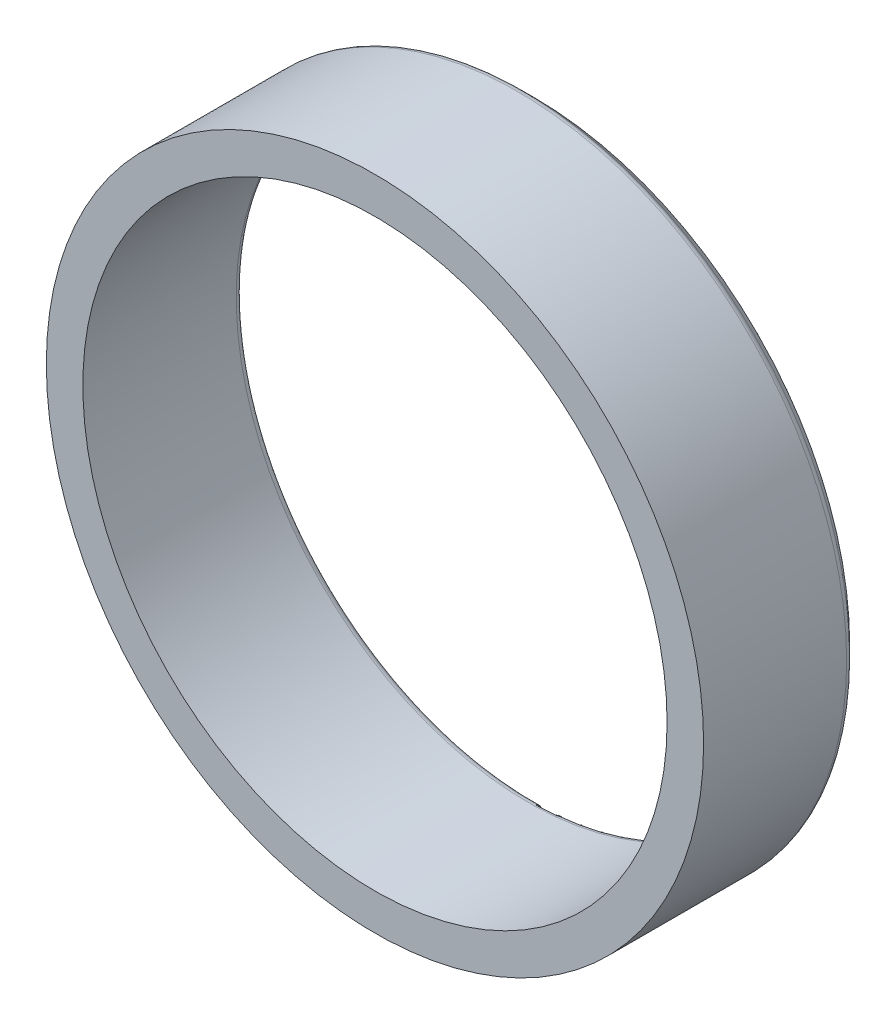
ISO-10303-21;
HEADER;
FILE_DESCRIPTION(('STEP AP214'),'2;1');
FILE_NAME('part.step','',(''),(''),'','','');
FILE_SCHEMA(('AUTOMOTIVE_DESIGN { 1 0 10303 214 1 1 1 1 }'));
ENDSEC;
DATA;
#1=APPLICATION_CONTEXT('core data for automotive mechanical design processes');
#2=APPLICATION_PROTOCOL_DEFINITION('international standard','automotive_design',2000,#1);
#3=PRODUCT_CONTEXT('',#1,'mechanical');
#4=PRODUCT('Part','Part','',(#3));
#5=PRODUCT_RELATED_PRODUCT_CATEGORY('part','',(#4));
#6=PRODUCT_DEFINITION_FORMATION('','',#4);
#7=PRODUCT_DEFINITION_CONTEXT('part definition',#1,'design');
#8=PRODUCT_DEFINITION('design','',#6,#7);
#9=PRODUCT_DEFINITION_SHAPE('','',#8);
#10=(LENGTH_UNIT() NAMED_UNIT(*) SI_UNIT(.MILLI.,.METRE.));
#11=(NAMED_UNIT(*) PLANE_ANGLE_UNIT() SI_UNIT($,.RADIAN.));
#12=(NAMED_UNIT(*) SI_UNIT($,.STERADIAN.) SOLID_ANGLE_UNIT());
#13=UNCERTAINTY_MEASURE_WITH_UNIT(LENGTH_MEASURE(1.E-05),#10,'distance_accuracy_value','');
#14=(GEOMETRIC_REPRESENTATION_CONTEXT(3) GLOBAL_UNCERTAINTY_ASSIGNED_CONTEXT((#13)) GLOBAL_UNIT_ASSIGNED_CONTEXT((#10,
#11,#12)) REPRESENTATION_CONTEXT('',''));
#15=CARTESIAN_POINT('',(0.,0.,0.));
#16=DIRECTION('',(0.,0.,1.));
#17=DIRECTION('',(1.,0.,0.));
#18=AXIS2_PLACEMENT_3D('',#15,#16,#17);
#19=CARTESIAN_POINT('',(0.,0.,22.));
#20=DIRECTION('',(0.,0.,1.));
#21=DIRECTION('',(1.,0.,0.));
#22=AXIS2_PLACEMENT_3D('',#19,#20,#21);
#23=PLANE('',#22);
#24=CARTESIAN_POINT('',(0.,0.,22.));
#25=DIRECTION('',(0.,0.,1.));
#26=DIRECTION('',(1.,0.,0.));
#27=AXIS2_PLACEMENT_3D('',#24,#25,#26);
#28=CIRCLE('',#27,45.);
#29=CARTESIAN_POINT('',(45.,0.,22.));
#30=VERTEX_POINT('',#29);
#31=EDGE_CURVE('E65',#30,#30,#28,.T.);
#32=ORIENTED_EDGE('',*,*,#31,.T.);
#33=EDGE_LOOP('',(#32));
#34=FACE_BOUND('',#33,.T.);
#35=CARTESIAN_POINT('',(0.,0.,22.));
#36=DIRECTION('',(0.,0.,1.));
#37=DIRECTION('',(1.,0.,0.));
#38=AXIS2_PLACEMENT_3D('',#35,#36,#37);
#39=CIRCLE('',#38,40.);
#40=CARTESIAN_POINT('',(40.,0.,22.));
#41=VERTEX_POINT('',#40);
#42=EDGE_CURVE('E67',#41,#41,#39,.T.);
#43=ORIENTED_EDGE('',*,*,#42,.F.);
#44=EDGE_LOOP('',(#43));
#45=FACE_BOUND('',#44,.T.);
#46=ADVANCED_FACE('F39',(#34,#45),#23,.T.);
#47=CARTESIAN_POINT('',(0.,0.,0.));
#48=DIRECTION('',(0.,0.,1.));
#49=DIRECTION('',(1.,0.,0.));
#50=AXIS2_PLACEMENT_3D('',#47,#48,#49);
#51=PLANE('',#50);
#52=CARTESIAN_POINT('',(0.,0.,0.));
#53=DIRECTION('',(0.,0.,1.));
#54=DIRECTION('',(1.,0.,0.));
#55=AXIS2_PLACEMENT_3D('',#52,#53,#54);
#56=CIRCLE('',#55,41.);
#57=CARTESIAN_POINT('',(41.,0.,0.));
#58=VERTEX_POINT('',#57);
#59=EDGE_CURVE('E46',#58,#58,#56,.T.);
#60=ORIENTED_EDGE('',*,*,#59,.T.);
#61=EDGE_LOOP('',(#60));
#62=FACE_BOUND('',#61,.T.);
#63=CARTESIAN_POINT('',(0.,0.,0.));
#64=DIRECTION('',(0.,0.,1.));
#65=DIRECTION('',(1.,0.,0.));
#66=AXIS2_PLACEMENT_3D('',#63,#64,#65);
#67=CIRCLE('',#66,42.5857864376269);
#68=CARTESIAN_POINT('',(42.5857864376269,0.,0.));
#69=VERTEX_POINT('',#68);
#70=EDGE_CURVE('E49',#69,#69,#67,.F.);
#71=ORIENTED_EDGE('',*,*,#70,.T.);
#72=EDGE_LOOP('',(#71));
#73=FACE_BOUND('',#72,.T.);
#74=ADVANCED_FACE('F73',(#62,#73),#51,.F.);
#75=CARTESIAN_POINT('',(0.,0.,22.));
#76=DIRECTION('',(0.,0.,-1.));
#77=DIRECTION('',(-1.,0.,0.));
#78=AXIS2_PLACEMENT_3D('',#75,#76,#77);
#79=CYLINDRICAL_SURFACE('',#78,45.);
#80=CARTESIAN_POINT('',(0.,0.,2.41421356237313));
#81=DIRECTION('',(0.,0.,-1.));
#82=DIRECTION('',(-1.,0.,0.));
#83=AXIS2_PLACEMENT_3D('',#80,#81,#82);
#84=CIRCLE('',#83,45.);
#85=CARTESIAN_POINT('',(-45.,0.,2.41421356237313));
#86=VERTEX_POINT('',#85);
#87=EDGE_CURVE('E62',#86,#86,#84,.F.);
#88=ORIENTED_EDGE('',*,*,#87,.T.);
#89=EDGE_LOOP('',(#88));
#90=FACE_BOUND('',#89,.T.);
#91=ORIENTED_EDGE('',*,*,#31,.F.);
#92=EDGE_LOOP('',(#91));
#93=FACE_BOUND('',#92,.T.);
#94=ADVANCED_FACE('F83',(#90,#93),#79,.T.);
#95=CARTESIAN_POINT('',(0.,0.,22.));
#96=DIRECTION('',(0.,0.,-1.));
#97=DIRECTION('',(-1.,0.,0.));
#98=AXIS2_PLACEMENT_3D('',#95,#96,#97);
#99=CYLINDRICAL_SURFACE('',#98,40.);
#100=CARTESIAN_POINT('',(0.,0.,1.));
#101=DIRECTION('',(0.,0.,1.));
#102=DIRECTION('',(1.,0.,0.));
#103=AXIS2_PLACEMENT_3D('',#100,#101,#102);
#104=CIRCLE('',#103,40.);
#105=CARTESIAN_POINT('',(40.,0.,1.));
#106=VERTEX_POINT('',#105);
#107=EDGE_CURVE('E10',#106,#106,#104,.F.);
#108=ORIENTED_EDGE('',*,*,#107,.T.);
#109=EDGE_LOOP('',(#108));
#110=FACE_BOUND('',#109,.T.);
#111=ORIENTED_EDGE('',*,*,#42,.T.);
#112=EDGE_LOOP('',(#111));
#113=FACE_BOUND('',#112,.T.);
#114=ADVANCED_FACE('F75',(#110,#113),#99,.F.);
#115=CARTESIAN_POINT('',(0.,0.,2.00000000000003));
#116=DIRECTION('',(0.,0.,1.));
#117=DIRECTION('',(1.,0.,0.));
#118=AXIS2_PLACEMENT_3D('',#115,#116,#117);
#119=CONICAL_SURFACE('',#118,45.,0.785398163397452);
#120=CARTESIAN_POINT('',(0.,0.,1.70710678118658));
#121=DIRECTION('',(0.,0.,1.));
#122=DIRECTION('',(1.,0.,0.));
#123=AXIS2_PLACEMENT_3D('',#120,#121,#122);
#124=CIRCLE('',#123,44.7071067811865);
#125=CARTESIAN_POINT('',(44.7071067811865,0.,1.70710678118658));
#126=VERTEX_POINT('',#125);
#127=EDGE_CURVE('E53',#126,#126,#124,.F.);
#128=ORIENTED_EDGE('',*,*,#127,.T.);
#129=EDGE_LOOP('',(#128));
#130=FACE_BOUND('',#129,.T.);
#131=CARTESIAN_POINT('',(0.,0.,0.292893218813463));
#132=DIRECTION('',(0.,0.,1.));
#133=DIRECTION('',(1.,0.,0.));
#134=AXIS2_PLACEMENT_3D('',#131,#132,#133);
#135=CIRCLE('',#134,43.2928932188134);
#136=CARTESIAN_POINT('',(43.2928932188134,0.,0.292893218813463));
#137=VERTEX_POINT('',#136);
#138=EDGE_CURVE('E56',#137,#137,#135,.T.);
#139=ORIENTED_EDGE('',*,*,#138,.T.);
#140=EDGE_LOOP('',(#139));
#141=FACE_BOUND('',#140,.T.);
#142=ADVANCED_FACE('F90',(#130,#141),#119,.T.);
#143=CARTESIAN_POINT('',(0.,0.,2.41421356237313));
#144=DIRECTION('',(0.,0.,-1.));
#145=DIRECTION('',(-1.,0.,0.));
#146=AXIS2_PLACEMENT_3D('',#143,#144,#145);
#147=TOROIDAL_SURFACE('',#146,44.,1.);
#148=ORIENTED_EDGE('',*,*,#127,.F.);
#149=EDGE_LOOP('',(#148));
#150=FACE_BOUND('',#149,.T.);
#151=ORIENTED_EDGE('',*,*,#87,.F.);
#152=EDGE_LOOP('',(#151));
#153=FACE_BOUND('',#152,.T.);
#154=ADVANCED_FACE('F94',(#150,#153),#147,.T.);
#155=CARTESIAN_POINT('',(0.,0.,1.));
#156=DIRECTION('',(0.,0.,1.));
#157=DIRECTION('',(1.,0.,0.));
#158=AXIS2_PLACEMENT_3D('',#155,#156,#157);
#159=TOROIDAL_SURFACE('',#158,41.,1.);
#160=ORIENTED_EDGE('',*,*,#107,.F.);
#161=EDGE_LOOP('',(#160));
#162=FACE_BOUND('',#161,.T.);
#163=ORIENTED_EDGE('',*,*,#59,.F.);
#164=EDGE_LOOP('',(#163));
#165=FACE_BOUND('',#164,.T.);
#166=ADVANCED_FACE('F100',(#162,#165),#159,.T.);
#167=CARTESIAN_POINT('',(0.,0.,1.));
#168=DIRECTION('',(0.,0.,1.));
#169=DIRECTION('',(1.,0.,0.));
#170=AXIS2_PLACEMENT_3D('',#167,#168,#169);
#171=TOROIDAL_SURFACE('',#170,42.5857864376269,1.);
#172=ORIENTED_EDGE('',*,*,#138,.F.);
#173=EDGE_LOOP('',(#172));
#174=FACE_BOUND('',#173,.T.);
#175=ORIENTED_EDGE('',*,*,#70,.F.);
#176=EDGE_LOOP('',(#175));
#177=FACE_BOUND('',#176,.T.);
#178=ADVANCED_FACE('F41',(#174,#177),#171,.T.);
#179=CLOSED_SHELL('',(#46,#74,#94,#114,#142,#154,#166,#178));
#180=MANIFOLD_SOLID_BREP('B2',#179);
#181=ADVANCED_BREP_SHAPE_REPRESENTATION('',(#18,#180),#14);
#182=SHAPE_DEFINITION_REPRESENTATION(#9,#181);
ENDSEC;
END-ISO-10303-21;
